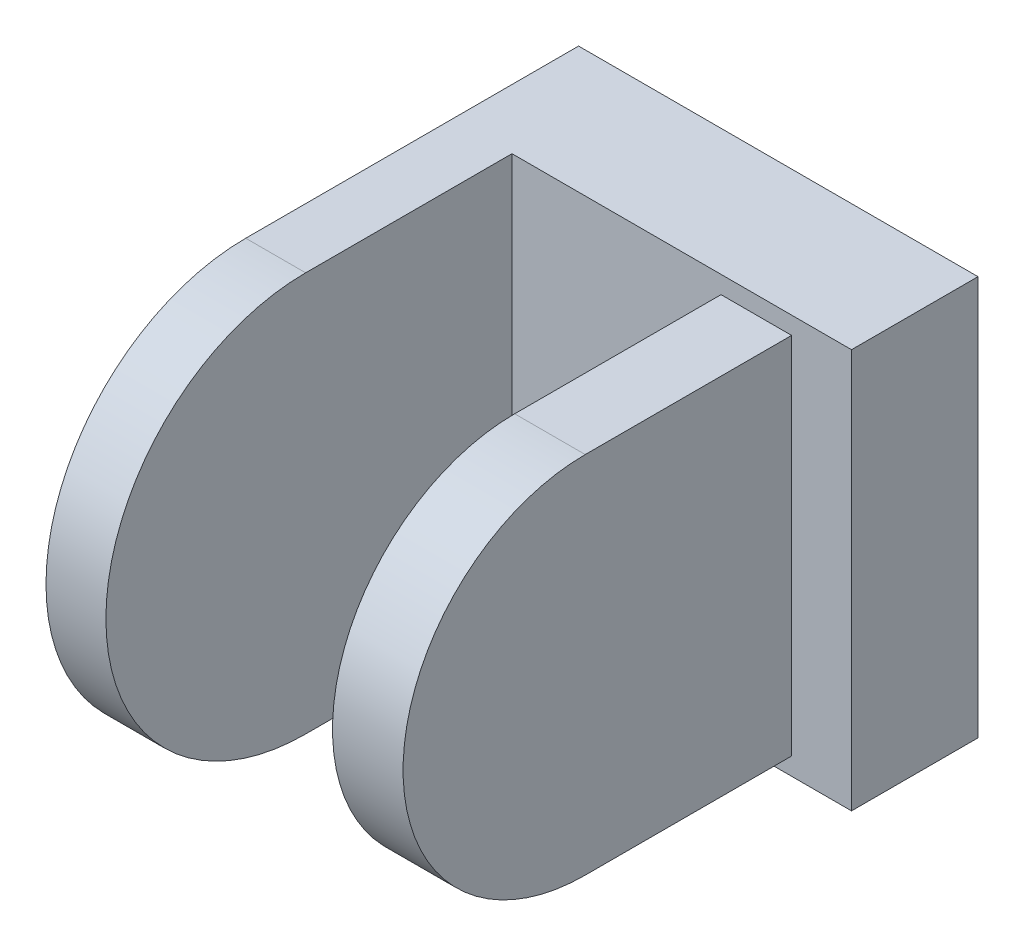
ISO-10303-21;
HEADER;
FILE_DESCRIPTION(('STEP AP214'),'2;1');
FILE_NAME('part.step','',(''),(''),'','','');
FILE_SCHEMA(('AUTOMOTIVE_DESIGN { 1 0 10303 214 1 1 1 1 }'));
ENDSEC;
DATA;
#1=APPLICATION_CONTEXT('core data for automotive mechanical design processes');
#2=APPLICATION_PROTOCOL_DEFINITION('international standard','automotive_design',2000,#1);
#3=PRODUCT_CONTEXT('',#1,'mechanical');
#4=PRODUCT('Part','Part','',(#3));
#5=PRODUCT_RELATED_PRODUCT_CATEGORY('part','',(#4));
#6=PRODUCT_DEFINITION_FORMATION('','',#4);
#7=PRODUCT_DEFINITION_CONTEXT('part definition',#1,'design');
#8=PRODUCT_DEFINITION('design','',#6,#7);
#9=PRODUCT_DEFINITION_SHAPE('','',#8);
#10=(LENGTH_UNIT() NAMED_UNIT(*) SI_UNIT(.MILLI.,.METRE.));
#11=(NAMED_UNIT(*) PLANE_ANGLE_UNIT() SI_UNIT($,.RADIAN.));
#12=(NAMED_UNIT(*) SI_UNIT($,.STERADIAN.) SOLID_ANGLE_UNIT());
#13=UNCERTAINTY_MEASURE_WITH_UNIT(LENGTH_MEASURE(1.E-05),#10,'distance_accuracy_value','');
#14=(GEOMETRIC_REPRESENTATION_CONTEXT(3) GLOBAL_UNCERTAINTY_ASSIGNED_CONTEXT((#13)) GLOBAL_UNIT_ASSIGNED_CONTEXT((#10,
#11,#12)) REPRESENTATION_CONTEXT('',''));
#15=CARTESIAN_POINT('',(0.,0.,0.));
#16=DIRECTION('',(0.,0.,1.));
#17=DIRECTION('',(1.,0.,0.));
#18=AXIS2_PLACEMENT_3D('',#15,#16,#17);
#19=CARTESIAN_POINT('',(10.5,0.,25.));
#20=DIRECTION('',(1.,0.,0.));
#21=DIRECTION('',(0.,-1.,0.));
#22=AXIS2_PLACEMENT_3D('',#19,#20,#21);
#23=CYLINDRICAL_SURFACE('',#22,13.68);
#24=CARTESIAN_POINT('',(10.5,0.,25.));
#25=DIRECTION('',(-1.,0.,0.));
#26=DIRECTION('',(0.,-1.,0.));
#27=AXIS2_PLACEMENT_3D('',#24,#25,#26);
#28=CIRCLE('',#27,13.68);
#29=CARTESIAN_POINT('',(10.5,-13.68,25.));
#30=VERTEX_POINT('',#29);
#31=CARTESIAN_POINT('',(10.5,13.68,25.));
#32=VERTEX_POINT('',#31);
#33=EDGE_CURVE('E206',#30,#32,#28,.T.);
#34=ORIENTED_EDGE('',*,*,#33,.T.);
#35=DIRECTION('',(-1.,0.,0.));
#36=VECTOR('',#35,1.);
#37=CARTESIAN_POINT('',(10.5,13.68,25.));
#38=LINE('',#37,#36);
#39=CARTESIAN_POINT('',(5.2,13.68,25.));
#40=VERTEX_POINT('',#39);
#41=EDGE_CURVE('E10',#32,#40,#38,.T.);
#42=ORIENTED_EDGE('',*,*,#41,.T.);
#43=CARTESIAN_POINT('',(5.2,0.,25.));
#44=DIRECTION('',(-1.,0.,0.));
#45=DIRECTION('',(0.,-1.,0.));
#46=AXIS2_PLACEMENT_3D('',#43,#44,#45);
#47=CIRCLE('',#46,13.68);
#48=CARTESIAN_POINT('',(5.2,-13.68,25.));
#49=VERTEX_POINT('',#48);
#50=EDGE_CURVE('E196',#49,#40,#47,.T.);
#51=ORIENTED_EDGE('',*,*,#50,.F.);
#52=DIRECTION('',(-1.,0.,0.));
#53=VECTOR('',#52,1.);
#54=CARTESIAN_POINT('',(10.5,-13.68,25.));
#55=LINE('',#54,#53);
#56=EDGE_CURVE('E20',#30,#49,#55,.T.);
#57=ORIENTED_EDGE('',*,*,#56,.F.);
#58=EDGE_LOOP('',(#34,#42,#51,#57));
#59=FACE_BOUND('',#58,.T.);
#60=ADVANCED_FACE('F16',(#59),#23,.T.);
#61=CARTESIAN_POINT('',(10.5,13.68,25.));
#62=DIRECTION('',(0.,1.,0.));
#63=DIRECTION('',(1.,0.,0.));
#64=AXIS2_PLACEMENT_3D('',#61,#62,#63);
#65=PLANE('',#64);
#66=DIRECTION('',(-1.,0.,0.));
#67=VECTOR('',#66,1.);
#68=CARTESIAN_POINT('',(5.25,13.68,9.5));
#69=LINE('',#68,#67);
#70=CARTESIAN_POINT('',(10.5,13.679999999272,9.5));
#71=VERTEX_POINT('',#70);
#72=CARTESIAN_POINT('',(5.2,13.68,9.5));
#73=VERTEX_POINT('',#72);
#74=EDGE_CURVE('E197',#71,#73,#69,.T.);
#75=ORIENTED_EDGE('',*,*,#74,.T.);
#76=DIRECTION('',(0.,0.,-1.));
#77=VECTOR('',#76,1.);
#78=CARTESIAN_POINT('',(5.2,13.68,25.));
#79=LINE('',#78,#77);
#80=EDGE_CURVE('E27',#40,#73,#79,.T.);
#81=ORIENTED_EDGE('',*,*,#80,.F.);
#82=ORIENTED_EDGE('',*,*,#41,.F.);
#83=DIRECTION('',(0.,0.,-1.));
#84=VECTOR('',#83,1.);
#85=CARTESIAN_POINT('',(10.5,13.68,17.25));
#86=LINE('',#85,#84);
#87=EDGE_CURVE('E204',#32,#71,#86,.T.);
#88=ORIENTED_EDGE('',*,*,#87,.T.);
#89=EDGE_LOOP('',(#75,#81,#82,#88));
#90=FACE_BOUND('',#89,.T.);
#91=ADVANCED_FACE('F441',(#90),#65,.T.);
#92=CARTESIAN_POINT('',(5.2,0.,9.5));
#93=DIRECTION('',(-1.,0.,0.));
#94=DIRECTION('',(0.,0.,1.));
#95=AXIS2_PLACEMENT_3D('',#92,#93,#94);
#96=PLANE('',#95);
#97=DIRECTION('',(0.,-1.,0.));
#98=VECTOR('',#97,1.);
#99=CARTESIAN_POINT('',(5.2,13.68,9.5));
#100=LINE('',#99,#98);
#101=CARTESIAN_POINT('',(5.2,-13.68,9.5));
#102=VERTEX_POINT('',#101);
#103=EDGE_CURVE('E201',#73,#102,#100,.T.);
#104=ORIENTED_EDGE('',*,*,#103,.T.);
#105=DIRECTION('',(0.,0.,1.));
#106=VECTOR('',#105,1.);
#107=CARTESIAN_POINT('',(5.2,-13.68,9.5));
#108=LINE('',#107,#106);
#109=EDGE_CURVE('E233',#102,#49,#108,.T.);
#110=ORIENTED_EDGE('',*,*,#109,.T.);
#111=ORIENTED_EDGE('',*,*,#50,.T.);
#112=ORIENTED_EDGE('',*,*,#80,.T.);
#113=EDGE_LOOP('',(#104,#110,#111,#112));
#114=FACE_BOUND('',#113,.T.);
#115=ADVANCED_FACE('F431',(#114),#96,.T.);
#116=CARTESIAN_POINT('',(10.5,-13.68,9.5));
#117=DIRECTION('',(0.,-1.,0.));
#118=DIRECTION('',(0.,0.,-1.));
#119=AXIS2_PLACEMENT_3D('',#116,#117,#118);
#120=PLANE('',#119);
#121=DIRECTION('',(-1.,0.,0.));
#122=VECTOR('',#121,1.);
#123=CARTESIAN_POINT('',(5.25,-13.68,9.5));
#124=LINE('',#123,#122);
#125=CARTESIAN_POINT('',(10.5,-13.679999999272,9.5));
#126=VERTEX_POINT('',#125);
#127=EDGE_CURVE('E213',#126,#102,#124,.T.);
#128=ORIENTED_EDGE('',*,*,#127,.F.);
#129=DIRECTION('',(0.,0.,1.));
#130=VECTOR('',#129,1.);
#131=CARTESIAN_POINT('',(10.5,-13.68,9.5));
#132=LINE('',#131,#130);
#133=EDGE_CURVE('E241',#126,#30,#132,.T.);
#134=ORIENTED_EDGE('',*,*,#133,.T.);
#135=ORIENTED_EDGE('',*,*,#56,.T.);
#136=ORIENTED_EDGE('',*,*,#109,.F.);
#137=EDGE_LOOP('',(#128,#134,#135,#136));
#138=FACE_BOUND('',#137,.T.);
#139=ADVANCED_FACE('F422',(#138),#120,.T.);
#140=CARTESIAN_POINT('',(10.5,0.,9.5));
#141=DIRECTION('',(-1.,0.,0.));
#142=DIRECTION('',(0.,0.,1.));
#143=AXIS2_PLACEMENT_3D('',#140,#141,#142);
#144=PLANE('',#143);
#145=DIRECTION('',(0.,-1.,0.));
#146=VECTOR('',#145,1.);
#147=CARTESIAN_POINT('',(10.5,13.67997821335,9.5));
#148=LINE('',#147,#146);
#149=EDGE_CURVE('E221',#71,#126,#148,.T.);
#150=ORIENTED_EDGE('',*,*,#149,.F.);
#151=ORIENTED_EDGE('',*,*,#87,.F.);
#152=ORIENTED_EDGE('',*,*,#33,.F.);
#153=ORIENTED_EDGE('',*,*,#133,.F.);
#154=EDGE_LOOP('',(#150,#151,#152,#153));
#155=FACE_BOUND('',#154,.T.);
#156=ADVANCED_FACE('F413',(#155),#144,.F.);
#157=CARTESIAN_POINT('',(15.,-15.,0.));
#158=DIRECTION('',(1.,0.,0.));
#159=DIRECTION('',(0.,1.,0.));
#160=AXIS2_PLACEMENT_3D('',#157,#158,#159);
#161=PLANE('',#160);
#162=DIRECTION('',(0.,1.,0.));
#163=VECTOR('',#162,1.);
#164=CARTESIAN_POINT('',(15.,-15.,0.));
#165=LINE('',#164,#163);
#166=CARTESIAN_POINT('',(15.,-15.,0.));
#167=VERTEX_POINT('',#166);
#168=CARTESIAN_POINT('',(15.,15.,0.));
#169=VERTEX_POINT('',#168);
#170=EDGE_CURVE('E183',#167,#169,#165,.T.);
#171=ORIENTED_EDGE('',*,*,#170,.T.);
#172=DIRECTION('',(0.,0.,1.));
#173=VECTOR('',#172,1.);
#174=CARTESIAN_POINT('',(15.,15.,0.));
#175=LINE('',#174,#173);
#176=CARTESIAN_POINT('',(15.,15.,9.5));
#177=VERTEX_POINT('',#176);
#178=EDGE_CURVE('E168',#169,#177,#175,.T.);
#179=ORIENTED_EDGE('',*,*,#178,.T.);
#180=DIRECTION('',(0.,1.,0.));
#181=VECTOR('',#180,1.);
#182=CARTESIAN_POINT('',(15.,-15.,9.5));
#183=LINE('',#182,#181);
#184=CARTESIAN_POINT('',(15.,-15.,9.5));
#185=VERTEX_POINT('',#184);
#186=EDGE_CURVE('E80',#185,#177,#183,.T.);
#187=ORIENTED_EDGE('',*,*,#186,.F.);
#188=DIRECTION('',(0.,0.,1.));
#189=VECTOR('',#188,1.);
#190=CARTESIAN_POINT('',(15.,-15.,0.));
#191=LINE('',#190,#189);
#192=EDGE_CURVE('E126',#167,#185,#191,.T.);
#193=ORIENTED_EDGE('',*,*,#192,.F.);
#194=EDGE_LOOP('',(#171,#179,#187,#193));
#195=FACE_BOUND('',#194,.T.);
#196=ADVANCED_FACE('F404',(#195),#161,.T.);
#197=CARTESIAN_POINT('',(-10.5,0.,25.));
#198=DIRECTION('',(1.,0.,0.));
#199=DIRECTION('',(0.,-1.,0.));
#200=AXIS2_PLACEMENT_3D('',#197,#198,#199);
#201=CYLINDRICAL_SURFACE('',#200,15.);
#202=CARTESIAN_POINT('',(-10.5,0.,25.));
#203=DIRECTION('',(-1.,0.,0.));
#204=DIRECTION('',(0.,-1.,0.));
#205=AXIS2_PLACEMENT_3D('',#202,#203,#204);
#206=CIRCLE('',#205,15.);
#207=CARTESIAN_POINT('',(-10.5,-15.,25.));
#208=VERTEX_POINT('',#207);
#209=CARTESIAN_POINT('',(-10.5,15.,25.));
#210=VERTEX_POINT('',#209);
#211=EDGE_CURVE('E146',#208,#210,#206,.T.);
#212=ORIENTED_EDGE('',*,*,#211,.T.);
#213=DIRECTION('',(-1.,0.,0.));
#214=VECTOR('',#213,1.);
#215=CARTESIAN_POINT('',(-10.5,15.,25.));
#216=LINE('',#215,#214);
#217=CARTESIAN_POINT('',(-15.,15.,25.));
#218=VERTEX_POINT('',#217);
#219=EDGE_CURVE('E163',#210,#218,#216,.T.);
#220=ORIENTED_EDGE('',*,*,#219,.T.);
#221=CARTESIAN_POINT('',(-15.,0.,25.));
#222=DIRECTION('',(-1.,0.,0.));
#223=DIRECTION('',(0.,-1.,0.));
#224=AXIS2_PLACEMENT_3D('',#221,#222,#223);
#225=CIRCLE('',#224,15.);
#226=CARTESIAN_POINT('',(-15.,-15.,25.));
#227=VERTEX_POINT('',#226);
#228=EDGE_CURVE('E169',#227,#218,#225,.T.);
#229=ORIENTED_EDGE('',*,*,#228,.F.);
#230=DIRECTION('',(-1.,0.,0.));
#231=VECTOR('',#230,1.);
#232=CARTESIAN_POINT('',(-10.5,-15.,25.));
#233=LINE('',#232,#231);
#234=EDGE_CURVE('E190',#208,#227,#233,.T.);
#235=ORIENTED_EDGE('',*,*,#234,.F.);
#236=EDGE_LOOP('',(#212,#220,#229,#235));
#237=FACE_BOUND('',#236,.T.);
#238=ADVANCED_FACE('F393',(#237),#201,.T.);
#239=CARTESIAN_POINT('',(-10.5,0.,9.5));
#240=DIRECTION('',(-1.,0.,0.));
#241=DIRECTION('',(0.,0.,1.));
#242=AXIS2_PLACEMENT_3D('',#239,#240,#241);
#243=PLANE('',#242);
#244=DIRECTION('',(0.,1.,0.));
#245=VECTOR('',#244,1.);
#246=CARTESIAN_POINT('',(-10.5,-15.,9.5));
#247=LINE('',#246,#245);
#248=CARTESIAN_POINT('',(-10.5,-15.,9.5));
#249=VERTEX_POINT('',#248);
#250=CARTESIAN_POINT('',(-10.5,15.,9.5));
#251=VERTEX_POINT('',#250);
#252=EDGE_CURVE('E65',#249,#251,#247,.T.);
#253=ORIENTED_EDGE('',*,*,#252,.T.);
#254=DIRECTION('',(0.,0.,-1.));
#255=VECTOR('',#254,1.);
#256=CARTESIAN_POINT('',(-10.5,15.,25.));
#257=LINE('',#256,#255);
#258=EDGE_CURVE('E152',#210,#251,#257,.T.);
#259=ORIENTED_EDGE('',*,*,#258,.F.);
#260=ORIENTED_EDGE('',*,*,#211,.F.);
#261=DIRECTION('',(0.,0.,1.));
#262=VECTOR('',#261,1.);
#263=CARTESIAN_POINT('',(-10.5,-15.,9.5));
#264=LINE('',#263,#262);
#265=EDGE_CURVE('E155',#249,#208,#264,.T.);
#266=ORIENTED_EDGE('',*,*,#265,.F.);
#267=EDGE_LOOP('',(#253,#259,#260,#266));
#268=FACE_BOUND('',#267,.T.);
#269=ADVANCED_FACE('F151',(#268),#243,.F.);
#270=CARTESIAN_POINT('',(0.,0.,9.5));
#271=DIRECTION('',(0.,0.,1.));
#272=DIRECTION('',(1.,0.,0.));
#273=AXIS2_PLACEMENT_3D('',#270,#271,#272);
#274=PLANE('',#273);
#275=ORIENTED_EDGE('',*,*,#149,.T.);
#276=ORIENTED_EDGE('',*,*,#127,.T.);
#277=ORIENTED_EDGE('',*,*,#103,.F.);
#278=ORIENTED_EDGE('',*,*,#74,.F.);
#279=EDGE_LOOP('',(#275,#276,#277,#278));
#280=FACE_BOUND('',#279,.T.);
#281=ORIENTED_EDGE('',*,*,#252,.F.);
#282=DIRECTION('',(1.,0.,0.));
#283=VECTOR('',#282,1.);
#284=CARTESIAN_POINT('',(-10.5,-15.,9.5));
#285=LINE('',#284,#283);
#286=EDGE_CURVE('E187',#249,#185,#285,.T.);
#287=ORIENTED_EDGE('',*,*,#286,.T.);
#288=ORIENTED_EDGE('',*,*,#186,.T.);
#289=DIRECTION('',(-1.,0.,0.));
#290=VECTOR('',#289,1.);
#291=CARTESIAN_POINT('',(15.,15.,9.5));
#292=LINE('',#291,#290);
#293=EDGE_CURVE('E162',#177,#251,#292,.T.);
#294=ORIENTED_EDGE('',*,*,#293,.T.);
#295=EDGE_LOOP('',(#281,#287,#288,#294));
#296=FACE_BOUND('',#295,.T.);
#297=ADVANCED_FACE('F166',(#280,#296),#274,.T.);
#298=CARTESIAN_POINT('',(15.,15.,0.));
#299=DIRECTION('',(0.,1.,0.));
#300=DIRECTION('',(1.,0.,0.));
#301=AXIS2_PLACEMENT_3D('',#298,#299,#300);
#302=PLANE('',#301);
#303=ORIENTED_EDGE('',*,*,#293,.F.);
#304=ORIENTED_EDGE('',*,*,#178,.F.);
#305=DIRECTION('',(-1.,0.,0.));
#306=VECTOR('',#305,1.);
#307=CARTESIAN_POINT('',(15.,15.,0.));
#308=LINE('',#307,#306);
#309=CARTESIAN_POINT('',(-15.,15.,0.));
#310=VERTEX_POINT('',#309);
#311=EDGE_CURVE('E180',#169,#310,#308,.T.);
#312=ORIENTED_EDGE('',*,*,#311,.T.);
#313=DIRECTION('',(0.,0.,1.));
#314=VECTOR('',#313,1.);
#315=CARTESIAN_POINT('',(-15.,15.,0.));
#316=LINE('',#315,#314);
#317=EDGE_CURVE('E119',#310,#218,#316,.T.);
#318=ORIENTED_EDGE('',*,*,#317,.T.);
#319=ORIENTED_EDGE('',*,*,#219,.F.);
#320=ORIENTED_EDGE('',*,*,#258,.T.);
#321=EDGE_LOOP('',(#303,#304,#312,#318,#319,#320));
#322=FACE_BOUND('',#321,.T.);
#323=ADVANCED_FACE('F161',(#322),#302,.T.);
#324=CARTESIAN_POINT('',(-15.,15.,0.));
#325=DIRECTION('',(-1.,0.,0.));
#326=DIRECTION('',(0.,0.,1.));
#327=AXIS2_PLACEMENT_3D('',#324,#325,#326);
#328=PLANE('',#327);
#329=ORIENTED_EDGE('',*,*,#317,.F.);
#330=DIRECTION('',(0.,-1.,0.));
#331=VECTOR('',#330,1.);
#332=CARTESIAN_POINT('',(-15.,15.,0.));
#333=LINE('',#332,#331);
#334=CARTESIAN_POINT('',(-15.,-15.,0.));
#335=VERTEX_POINT('',#334);
#336=EDGE_CURVE('E184',#310,#335,#333,.T.);
#337=ORIENTED_EDGE('',*,*,#336,.T.);
#338=DIRECTION('',(0.,0.,-1.));
#339=VECTOR('',#338,1.);
#340=CARTESIAN_POINT('',(-15.,-15.,25.));
#341=LINE('',#340,#339);
#342=EDGE_CURVE('E134',#227,#335,#341,.T.);
#343=ORIENTED_EDGE('',*,*,#342,.F.);
#344=ORIENTED_EDGE('',*,*,#228,.T.);
#345=EDGE_LOOP('',(#329,#337,#343,#344));
#346=FACE_BOUND('',#345,.T.);
#347=ADVANCED_FACE('F18',(#346),#328,.T.);
#348=CARTESIAN_POINT('',(-15.,-15.,0.));
#349=DIRECTION('',(0.,-1.,0.));
#350=DIRECTION('',(0.,0.,-1.));
#351=AXIS2_PLACEMENT_3D('',#348,#349,#350);
#352=PLANE('',#351);
#353=ORIENTED_EDGE('',*,*,#342,.T.);
#354=DIRECTION('',(1.,0.,0.));
#355=VECTOR('',#354,1.);
#356=CARTESIAN_POINT('',(-15.,-15.,0.));
#357=LINE('',#356,#355);
#358=EDGE_CURVE('E191',#335,#167,#357,.T.);
#359=ORIENTED_EDGE('',*,*,#358,.T.);
#360=ORIENTED_EDGE('',*,*,#192,.T.);
#361=ORIENTED_EDGE('',*,*,#286,.F.);
#362=ORIENTED_EDGE('',*,*,#265,.T.);
#363=ORIENTED_EDGE('',*,*,#234,.T.);
#364=EDGE_LOOP('',(#353,#359,#360,#361,#362,#363));
#365=FACE_BOUND('',#364,.T.);
#366=ADVANCED_FACE('F341',(#365),#352,.T.);
#367=CARTESIAN_POINT('',(0.,0.,0.));
#368=DIRECTION('',(0.,0.,1.));
#369=DIRECTION('',(1.,0.,0.));
#370=AXIS2_PLACEMENT_3D('',#367,#368,#369);
#371=PLANE('',#370);
#372=ORIENTED_EDGE('',*,*,#358,.F.);
#373=ORIENTED_EDGE('',*,*,#336,.F.);
#374=ORIENTED_EDGE('',*,*,#311,.F.);
#375=ORIENTED_EDGE('',*,*,#170,.F.);
#376=EDGE_LOOP('',(#372,#373,#374,#375));
#377=FACE_BOUND('',#376,.T.);
#378=ADVANCED_FACE('F335',(#377),#371,.F.);
#379=CLOSED_SHELL('',(#60,#91,#115,#139,#156,#196,#238,#269,#297,#323,#347,#366,#378));
#380=MANIFOLD_SOLID_BREP('B1',#379);
#381=ADVANCED_BREP_SHAPE_REPRESENTATION('',(#18,#380),#14);
#382=SHAPE_DEFINITION_REPRESENTATION(#9,#381);
ENDSEC;
END-ISO-10303-21;
